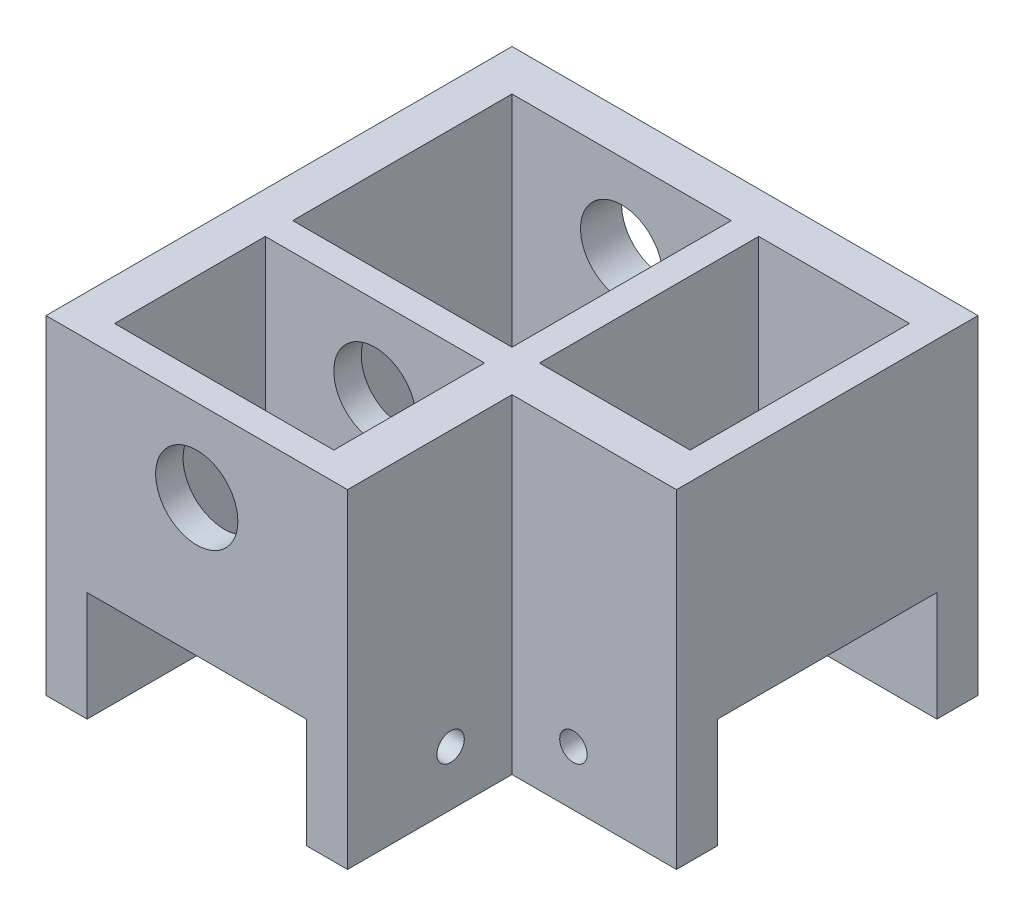
ISO-10303-21;
HEADER;
FILE_DESCRIPTION(('STEP AP214'),'2;1');
FILE_NAME('part.step','',(''),(''),'','','');
FILE_SCHEMA(('AUTOMOTIVE_DESIGN { 1 0 10303 214 1 1 1 1 }'));
ENDSEC;
DATA;
#1=APPLICATION_CONTEXT('core data for automotive mechanical design processes');
#2=APPLICATION_PROTOCOL_DEFINITION('international standard','automotive_design',2000,#1);
#3=PRODUCT_CONTEXT('',#1,'mechanical');
#4=PRODUCT('Part','Part','',(#3));
#5=PRODUCT_RELATED_PRODUCT_CATEGORY('part','',(#4));
#6=PRODUCT_DEFINITION_FORMATION('','',#4);
#7=PRODUCT_DEFINITION_CONTEXT('part definition',#1,'design');
#8=PRODUCT_DEFINITION('design','',#6,#7);
#9=PRODUCT_DEFINITION_SHAPE('','',#8);
#10=(LENGTH_UNIT() NAMED_UNIT(*) SI_UNIT(.MILLI.,.METRE.));
#11=(NAMED_UNIT(*) PLANE_ANGLE_UNIT() SI_UNIT($,.RADIAN.));
#12=(NAMED_UNIT(*) SI_UNIT($,.STERADIAN.) SOLID_ANGLE_UNIT());
#13=UNCERTAINTY_MEASURE_WITH_UNIT(LENGTH_MEASURE(1.E-05),#10,'distance_accuracy_value','');
#14=(GEOMETRIC_REPRESENTATION_CONTEXT(3) GLOBAL_UNCERTAINTY_ASSIGNED_CONTEXT((#13)) GLOBAL_UNIT_ASSIGNED_CONTEXT((#10,
#11,#12)) REPRESENTATION_CONTEXT('',''));
#15=CARTESIAN_POINT('',(0.,0.,0.));
#16=DIRECTION('',(0.,0.,1.));
#17=DIRECTION('',(1.,0.,0.));
#18=AXIS2_PLACEMENT_3D('',#15,#16,#17);
#19=CARTESIAN_POINT('',(144.78,152.4,0.));
#20=DIRECTION('',(0.,1.,0.));
#21=DIRECTION('',(0.,0.,1.));
#22=AXIS2_PLACEMENT_3D('',#19,#20,#21);
#23=PLANE('',#22);
#24=DIRECTION('',(0.,0.,1.));
#25=VECTOR('',#24,1.);
#26=CARTESIAN_POINT('',(278.13,152.4,-50.8));
#27=LINE('',#26,#25);
#28=CARTESIAN_POINT('',(278.13,152.4,-50.8));
#29=VERTEX_POINT('',#28);
#30=CARTESIAN_POINT('',(278.13,152.4,50.8));
#31=VERTEX_POINT('',#30);
#32=EDGE_CURVE('E299',#29,#31,#27,.T.);
#33=ORIENTED_EDGE('',*,*,#32,.T.);
#34=DIRECTION('',(-1.,0.,0.));
#35=VECTOR('',#34,1.);
#36=CARTESIAN_POINT('',(278.13,152.4,50.8));
#37=LINE('',#36,#35);
#38=CARTESIAN_POINT('',(208.28,152.4,50.8));
#39=VERTEX_POINT('',#38);
#40=EDGE_CURVE('E302',#31,#39,#37,.T.);
#41=ORIENTED_EDGE('',*,*,#40,.T.);
#42=DIRECTION('',(0.,0.,-1.));
#43=VECTOR('',#42,1.);
#44=CARTESIAN_POINT('',(208.28,152.4,-50.8));
#45=LINE('',#44,#43);
#46=CARTESIAN_POINT('',(208.28,152.4,-50.8));
#47=VERTEX_POINT('',#46);
#48=EDGE_CURVE('E305',#39,#47,#45,.T.);
#49=ORIENTED_EDGE('',*,*,#48,.T.);
#50=DIRECTION('',(1.,0.,0.));
#51=VECTOR('',#50,1.);
#52=CARTESIAN_POINT('',(278.13,152.4,-50.8));
#53=LINE('',#52,#51);
#54=EDGE_CURVE('E308',#47,#29,#53,.T.);
#55=ORIENTED_EDGE('',*,*,#54,.T.);
#56=EDGE_LOOP('',(#33,#41,#49,#55));
#57=FACE_BOUND('',#56,.T.);
#58=DIRECTION('',(0.,0.,-1.));
#59=VECTOR('',#58,1.);
#60=CARTESIAN_POINT('',(74.93,152.4,0.));
#61=LINE('',#60,#59);
#62=CARTESIAN_POINT('',(74.9299999999999,152.4,146.05));
#63=VERTEX_POINT('',#62);
#64=CARTESIAN_POINT('',(74.93,152.4,-69.85));
#65=VERTEX_POINT('',#64);
#66=EDGE_CURVE('E380',#63,#65,#61,.T.);
#67=ORIENTED_EDGE('',*,*,#66,.F.);
#68=DIRECTION('',(-1.,0.,0.));
#69=VECTOR('',#68,1.);
#70=CARTESIAN_POINT('',(214.63,152.4,146.05));
#71=LINE('',#70,#69);
#72=CARTESIAN_POINT('',(214.63,152.4,146.05));
#73=VERTEX_POINT('',#72);
#74=EDGE_CURVE('E254',#73,#63,#71,.T.);
#75=ORIENTED_EDGE('',*,*,#74,.F.);
#76=DIRECTION('',(0.,0.,-1.));
#77=VECTOR('',#76,1.);
#78=CARTESIAN_POINT('',(214.63,152.4,146.05));
#79=LINE('',#78,#77);
#80=CARTESIAN_POINT('',(214.63,152.4,69.85));
#81=VERTEX_POINT('',#80);
#82=EDGE_CURVE('E271',#73,#81,#79,.T.);
#83=ORIENTED_EDGE('',*,*,#82,.T.);
#84=DIRECTION('',(-1.,0.,0.));
#85=VECTOR('',#84,1.);
#86=CARTESIAN_POINT('',(144.78,152.4,69.85));
#87=LINE('',#86,#85);
#88=CARTESIAN_POINT('',(290.83,152.4,69.85));
#89=VERTEX_POINT('',#88);
#90=EDGE_CURVE('E387',#89,#81,#87,.T.);
#91=ORIENTED_EDGE('',*,*,#90,.F.);
#92=DIRECTION('',(0.,0.,-1.));
#93=VECTOR('',#92,1.);
#94=CARTESIAN_POINT('',(290.83,152.4,69.85));
#95=LINE('',#94,#93);
#96=CARTESIAN_POINT('',(290.83,152.4,-69.85));
#97=VERTEX_POINT('',#96);
#98=EDGE_CURVE('E330',#89,#97,#95,.T.);
#99=ORIENTED_EDGE('',*,*,#98,.T.);
#100=DIRECTION('',(1.,0.,0.));
#101=VECTOR('',#100,1.);
#102=CARTESIAN_POINT('',(144.78,152.4,-69.85));
#103=LINE('',#102,#101);
#104=EDGE_CURVE('E383',#65,#97,#103,.T.);
#105=ORIENTED_EDGE('',*,*,#104,.F.);
#106=EDGE_LOOP('',(#67,#75,#83,#91,#99,#105));
#107=FACE_BOUND('',#106,.T.);
#108=DIRECTION('',(1.,0.,0.));
#109=VECTOR('',#108,1.);
#110=CARTESIAN_POINT('',(195.58,152.4,-50.8));
#111=LINE('',#110,#109);
#112=CARTESIAN_POINT('',(93.98,152.4,-50.8));
#113=VERTEX_POINT('',#112);
#114=CARTESIAN_POINT('',(195.58,152.4,-50.8));
#115=VERTEX_POINT('',#114);
#116=EDGE_CURVE('E353',#113,#115,#111,.T.);
#117=ORIENTED_EDGE('',*,*,#116,.T.);
#118=DIRECTION('',(0.,0.,1.));
#119=VECTOR('',#118,1.);
#120=CARTESIAN_POINT('',(195.58,152.4,50.8));
#121=LINE('',#120,#119);
#122=CARTESIAN_POINT('',(195.58,152.4,50.8));
#123=VERTEX_POINT('',#122);
#124=EDGE_CURVE('E357',#115,#123,#121,.T.);
#125=ORIENTED_EDGE('',*,*,#124,.T.);
#126=DIRECTION('',(-1.,0.,0.));
#127=VECTOR('',#126,1.);
#128=CARTESIAN_POINT('',(195.58,152.4,50.8));
#129=LINE('',#128,#127);
#130=CARTESIAN_POINT('',(93.98,152.4,50.8));
#131=VERTEX_POINT('',#130);
#132=EDGE_CURVE('E360',#123,#131,#129,.T.);
#133=ORIENTED_EDGE('',*,*,#132,.T.);
#134=DIRECTION('',(0.,0.,-1.));
#135=VECTOR('',#134,1.);
#136=CARTESIAN_POINT('',(93.98,152.4,50.8));
#137=LINE('',#136,#135);
#138=EDGE_CURVE('E350',#131,#113,#137,.T.);
#139=ORIENTED_EDGE('',*,*,#138,.T.);
#140=EDGE_LOOP('',(#117,#125,#133,#139));
#141=FACE_BOUND('',#140,.T.);
#142=DIRECTION('',(0.,0.,1.));
#143=VECTOR('',#142,1.);
#144=CARTESIAN_POINT('',(93.9799999999999,152.4,133.35));
#145=LINE('',#144,#143);
#146=CARTESIAN_POINT('',(93.98,152.4,63.5));
#147=VERTEX_POINT('',#146);
#148=CARTESIAN_POINT('',(93.9799999999999,152.4,133.35));
#149=VERTEX_POINT('',#148);
#150=EDGE_CURVE('E221',#147,#149,#145,.T.);
#151=ORIENTED_EDGE('',*,*,#150,.F.);
#152=DIRECTION('',(-1.,0.,0.));
#153=VECTOR('',#152,1.);
#154=CARTESIAN_POINT('',(93.98,152.4,63.5));
#155=LINE('',#154,#153);
#156=CARTESIAN_POINT('',(195.58,152.4,63.5));
#157=VERTEX_POINT('',#156);
#158=EDGE_CURVE('E228',#157,#147,#155,.T.);
#159=ORIENTED_EDGE('',*,*,#158,.F.);
#160=DIRECTION('',(0.,0.,-1.));
#161=VECTOR('',#160,1.);
#162=CARTESIAN_POINT('',(195.58,152.4,133.35));
#163=LINE('',#162,#161);
#164=CARTESIAN_POINT('',(195.58,152.4,133.35));
#165=VERTEX_POINT('',#164);
#166=EDGE_CURVE('E233',#165,#157,#163,.T.);
#167=ORIENTED_EDGE('',*,*,#166,.F.);
#168=DIRECTION('',(1.,0.,0.));
#169=VECTOR('',#168,1.);
#170=CARTESIAN_POINT('',(93.9799999999999,152.4,133.35));
#171=LINE('',#170,#169);
#172=EDGE_CURVE('E235',#149,#165,#171,.T.);
#173=ORIENTED_EDGE('',*,*,#172,.F.);
#174=EDGE_LOOP('',(#151,#159,#167,#173));
#175=FACE_BOUND('',#174,.T.);
#176=ADVANCED_FACE('F65',(#57,#107,#141,#175),#23,.T.);
#177=CARTESIAN_POINT('',(144.78,50.8,0.));
#178=DIRECTION('',(0.,1.,0.));
#179=DIRECTION('',(0.,0.,1.));
#180=AXIS2_PLACEMENT_3D('',#177,#178,#179);
#181=PLANE('',#180);
#182=DIRECTION('',(1.,0.,0.));
#183=VECTOR('',#182,1.);
#184=CARTESIAN_POINT('',(144.78,50.8,133.35));
#185=LINE('',#184,#183);
#186=CARTESIAN_POINT('',(93.9799999999999,50.8,133.35));
#187=VERTEX_POINT('',#186);
#188=CARTESIAN_POINT('',(195.58,50.8,133.35));
#189=VERTEX_POINT('',#188);
#190=EDGE_CURVE('E12',#187,#189,#185,.T.);
#191=ORIENTED_EDGE('',*,*,#190,.T.);
#192=DIRECTION('',(0.,0.,1.));
#193=VECTOR('',#192,1.);
#194=CARTESIAN_POINT('',(195.58,50.8,50.8));
#195=LINE('',#194,#193);
#196=CARTESIAN_POINT('',(195.58,50.8,146.05));
#197=VERTEX_POINT('',#196);
#198=EDGE_CURVE('E282',#189,#197,#195,.T.);
#199=ORIENTED_EDGE('',*,*,#198,.T.);
#200=DIRECTION('',(1.,0.,0.));
#201=VECTOR('',#200,1.);
#202=CARTESIAN_POINT('',(93.9799999999999,50.8,146.05));
#203=LINE('',#202,#201);
#204=CARTESIAN_POINT('',(93.9799999999999,50.8,146.05));
#205=VERTEX_POINT('',#204);
#206=EDGE_CURVE('E264',#205,#197,#203,.T.);
#207=ORIENTED_EDGE('',*,*,#206,.F.);
#208=DIRECTION('',(0.,0.,-1.));
#209=VECTOR('',#208,1.);
#210=CARTESIAN_POINT('',(93.98,50.8,50.8));
#211=LINE('',#210,#209);
#212=EDGE_CURVE('E286',#205,#187,#211,.T.);
#213=ORIENTED_EDGE('',*,*,#212,.T.);
#214=EDGE_LOOP('',(#191,#199,#207,#213));
#215=FACE_BOUND('',#214,.T.);
#216=ADVANCED_FACE('F431',(#215),#181,.F.);
#217=DIRECTION('',(-1.,0.,0.));
#218=VECTOR('',#217,1.);
#219=CARTESIAN_POINT('',(144.78,50.8,63.5));
#220=LINE('',#219,#218);
#221=CARTESIAN_POINT('',(195.58,50.8,63.5));
#222=VERTEX_POINT('',#221);
#223=CARTESIAN_POINT('',(93.98,50.8,63.5));
#224=VERTEX_POINT('',#223);
#225=EDGE_CURVE('E74',#222,#224,#220,.T.);
#226=ORIENTED_EDGE('',*,*,#225,.T.);
#227=CARTESIAN_POINT('',(93.98,50.8,50.8));
#228=VERTEX_POINT('',#227);
#229=EDGE_CURVE('E223',#224,#228,#211,.T.);
#230=ORIENTED_EDGE('',*,*,#229,.T.);
#231=DIRECTION('',(1.,0.,0.));
#232=VECTOR('',#231,1.);
#233=CARTESIAN_POINT('',(195.58,50.8,50.8));
#234=LINE('',#233,#232);
#235=CARTESIAN_POINT('',(195.58,50.8,50.8));
#236=VERTEX_POINT('',#235);
#237=EDGE_CURVE('E283',#228,#236,#234,.T.);
#238=ORIENTED_EDGE('',*,*,#237,.T.);
#239=EDGE_CURVE('E278',#236,#222,#195,.T.);
#240=ORIENTED_EDGE('',*,*,#239,.T.);
#241=EDGE_LOOP('',(#226,#230,#238,#240));
#242=FACE_BOUND('',#241,.T.);
#243=ADVANCED_FACE('F406',(#242),#181,.F.);
#244=CARTESIAN_POINT('',(144.78,0.,0.));
#245=DIRECTION('',(0.,1.,0.));
#246=DIRECTION('',(0.,0.,1.));
#247=AXIS2_PLACEMENT_3D('',#244,#245,#246);
#248=PLANE('',#247);
#249=DIRECTION('',(0.,0.,1.));
#250=VECTOR('',#249,1.);
#251=CARTESIAN_POINT('',(195.58,0.,50.8));
#252=LINE('',#251,#250);
#253=CARTESIAN_POINT('',(195.58,0.,50.8));
#254=VERTEX_POINT('',#253);
#255=CARTESIAN_POINT('',(195.58,0.,146.05));
#256=VERTEX_POINT('',#255);
#257=EDGE_CURVE('E275',#254,#256,#252,.T.);
#258=ORIENTED_EDGE('',*,*,#257,.F.);
#259=DIRECTION('',(-1.,0.,0.));
#260=VECTOR('',#259,1.);
#261=CARTESIAN_POINT('',(195.58,0.,50.8));
#262=LINE('',#261,#260);
#263=CARTESIAN_POINT('',(290.83,0.,50.8));
#264=VERTEX_POINT('',#263);
#265=EDGE_CURVE('E354',#264,#254,#262,.T.);
#266=ORIENTED_EDGE('',*,*,#265,.F.);
#267=DIRECTION('',(0.,0.,1.));
#268=VECTOR('',#267,1.);
#269=CARTESIAN_POINT('',(290.83,0.,50.8));
#270=LINE('',#269,#268);
#271=CARTESIAN_POINT('',(290.83,0.,69.85));
#272=VERTEX_POINT('',#271);
#273=EDGE_CURVE('E325',#264,#272,#270,.T.);
#274=ORIENTED_EDGE('',*,*,#273,.T.);
#275=DIRECTION('',(-1.,0.,0.));
#276=VECTOR('',#275,1.);
#277=CARTESIAN_POINT('',(144.78,0.,69.85));
#278=LINE('',#277,#276);
#279=CARTESIAN_POINT('',(214.63,0.,69.85));
#280=VERTEX_POINT('',#279);
#281=EDGE_CURVE('E384',#272,#280,#278,.T.);
#282=ORIENTED_EDGE('',*,*,#281,.T.);
#283=DIRECTION('',(0.,0.,-1.));
#284=VECTOR('',#283,1.);
#285=CARTESIAN_POINT('',(214.63,0.,146.05));
#286=LINE('',#285,#284);
#287=CARTESIAN_POINT('',(214.63,0.,146.05));
#288=VERTEX_POINT('',#287);
#289=EDGE_CURVE('E267',#288,#280,#286,.T.);
#290=ORIENTED_EDGE('',*,*,#289,.F.);
#291=DIRECTION('',(1.,0.,0.));
#292=VECTOR('',#291,1.);
#293=CARTESIAN_POINT('',(195.58,0.,146.05));
#294=LINE('',#293,#292);
#295=EDGE_CURVE('E259',#256,#288,#294,.T.);
#296=ORIENTED_EDGE('',*,*,#295,.F.);
#297=EDGE_LOOP('',(#258,#266,#274,#282,#290,#296));
#298=FACE_BOUND('',#297,.T.);
#299=ADVANCED_FACE('F443',(#298),#248,.F.);
#300=DIRECTION('',(0.,0.,-1.));
#301=VECTOR('',#300,1.);
#302=CARTESIAN_POINT('',(74.93,0.,0.));
#303=LINE('',#302,#301);
#304=CARTESIAN_POINT('',(74.9299999999999,0.,146.05));
#305=VERTEX_POINT('',#304);
#306=CARTESIAN_POINT('',(74.93,0.,-69.85));
#307=VERTEX_POINT('',#306);
#308=EDGE_CURVE('E379',#305,#307,#303,.T.);
#309=ORIENTED_EDGE('',*,*,#308,.T.);
#310=DIRECTION('',(1.,0.,0.));
#311=VECTOR('',#310,1.);
#312=CARTESIAN_POINT('',(144.78,0.,-69.85));
#313=LINE('',#312,#311);
#314=CARTESIAN_POINT('',(290.83,0.,-69.85));
#315=VERTEX_POINT('',#314);
#316=EDGE_CURVE('E393',#307,#315,#313,.T.);
#317=ORIENTED_EDGE('',*,*,#316,.T.);
#318=DIRECTION('',(0.,0.,1.));
#319=VECTOR('',#318,1.);
#320=CARTESIAN_POINT('',(290.83,0.,-69.85));
#321=LINE('',#320,#319);
#322=CARTESIAN_POINT('',(290.83,0.,-50.8));
#323=VERTEX_POINT('',#322);
#324=EDGE_CURVE('E335',#315,#323,#321,.T.);
#325=ORIENTED_EDGE('',*,*,#324,.T.);
#326=DIRECTION('',(1.,0.,0.));
#327=VECTOR('',#326,1.);
#328=CARTESIAN_POINT('',(195.58,0.,-50.8));
#329=LINE('',#328,#327);
#330=CARTESIAN_POINT('',(93.98,0.,-50.8));
#331=VERTEX_POINT('',#330);
#332=EDGE_CURVE('E366',#331,#323,#329,.T.);
#333=ORIENTED_EDGE('',*,*,#332,.F.);
#334=DIRECTION('',(0.,0.,-1.));
#335=VECTOR('',#334,1.);
#336=CARTESIAN_POINT('',(93.98,0.,50.8));
#337=LINE('',#336,#335);
#338=CARTESIAN_POINT('',(93.9799999999999,0.,146.05));
#339=VERTEX_POINT('',#338);
#340=EDGE_CURVE('E346',#339,#331,#337,.T.);
#341=ORIENTED_EDGE('',*,*,#340,.F.);
#342=DIRECTION('',(1.,0.,0.));
#343=VECTOR('',#342,1.);
#344=CARTESIAN_POINT('',(74.9299999999999,0.,146.05));
#345=LINE('',#344,#343);
#346=EDGE_CURVE('E249',#305,#339,#345,.T.);
#347=ORIENTED_EDGE('',*,*,#346,.F.);
#348=EDGE_LOOP('',(#309,#317,#325,#333,#341,#347));
#349=FACE_BOUND('',#348,.T.);
#350=ADVANCED_FACE('F446',(#349),#248,.F.);
#351=CARTESIAN_POINT('',(144.78,152.4,69.85));
#352=DIRECTION('',(0.,0.,-1.));
#353=DIRECTION('',(1.,0.,0.));
#354=AXIS2_PLACEMENT_3D('',#351,#352,#353);
#355=PLANE('',#354);
#356=CARTESIAN_POINT('',(243.078,25.4,69.85));
#357=DIRECTION('',(0.,0.,-1.));
#358=DIRECTION('',(-1.,0.,0.));
#359=AXIS2_PLACEMENT_3D('',#356,#357,#358);
#360=CIRCLE('',#359,6.35);
#361=CARTESIAN_POINT('',(236.728,25.4,69.85));
#362=VERTEX_POINT('',#361);
#363=EDGE_CURVE('E281',#362,#362,#360,.T.);
#364=ORIENTED_EDGE('',*,*,#363,.T.);
#365=EDGE_LOOP('',(#364));
#366=FACE_BOUND('',#365,.T.);
#367=ORIENTED_EDGE('',*,*,#281,.F.);
#368=DIRECTION('',(0.,1.,0.));
#369=VECTOR('',#368,1.);
#370=CARTESIAN_POINT('',(290.83,0.,69.85));
#371=LINE('',#370,#369);
#372=EDGE_CURVE('E328',#272,#89,#371,.T.);
#373=ORIENTED_EDGE('',*,*,#372,.T.);
#374=ORIENTED_EDGE('',*,*,#90,.T.);
#375=DIRECTION('',(0.,1.,0.));
#376=VECTOR('',#375,1.);
#377=CARTESIAN_POINT('',(214.63,0.,69.85));
#378=LINE('',#377,#376);
#379=EDGE_CURVE('E244',#280,#81,#378,.T.);
#380=ORIENTED_EDGE('',*,*,#379,.F.);
#381=EDGE_LOOP('',(#367,#373,#374,#380));
#382=FACE_BOUND('',#381,.T.);
#383=ADVANCED_FACE('F448',(#366,#382),#355,.F.);
#384=CARTESIAN_POINT('',(195.58,152.4,50.8));
#385=DIRECTION('',(0.,0.,-1.));
#386=DIRECTION('',(1.,0.,0.));
#387=AXIS2_PLACEMENT_3D('',#384,#385,#386);
#388=PLANE('',#387);
#389=CARTESIAN_POINT('',(243.078,25.4,50.8));
#390=DIRECTION('',(0.,0.,1.));
#391=DIRECTION('',(1.,0.,0.));
#392=AXIS2_PLACEMENT_3D('',#389,#390,#391);
#393=CIRCLE('',#392,6.35);
#394=CARTESIAN_POINT('',(249.428,25.4,50.8));
#395=VERTEX_POINT('',#394);
#396=EDGE_CURVE('E293',#395,#395,#393,.T.);
#397=ORIENTED_EDGE('',*,*,#396,.T.);
#398=EDGE_LOOP('',(#397));
#399=FACE_BOUND('',#398,.T.);
#400=DIRECTION('',(1.,0.,0.));
#401=VECTOR('',#400,1.);
#402=CARTESIAN_POINT('',(195.58,50.8,50.8));
#403=LINE('',#402,#401);
#404=CARTESIAN_POINT('',(208.28,50.8,50.8));
#405=VERTEX_POINT('',#404);
#406=EDGE_CURVE('E339',#236,#405,#403,.T.);
#407=ORIENTED_EDGE('',*,*,#406,.T.);
#408=DIRECTION('',(0.,1.,0.));
#409=VECTOR('',#408,1.);
#410=CARTESIAN_POINT('',(208.28,0.,50.8));
#411=LINE('',#410,#409);
#412=EDGE_CURVE('E317',#405,#39,#411,.T.);
#413=ORIENTED_EDGE('',*,*,#412,.T.);
#414=ORIENTED_EDGE('',*,*,#40,.F.);
#415=DIRECTION('',(0.,1.,0.));
#416=VECTOR('',#415,1.);
#417=CARTESIAN_POINT('',(278.13,0.,50.8));
#418=LINE('',#417,#416);
#419=CARTESIAN_POINT('',(278.13,50.8,50.8));
#420=VERTEX_POINT('',#419);
#421=EDGE_CURVE('E311',#420,#31,#418,.T.);
#422=ORIENTED_EDGE('',*,*,#421,.F.);
#423=CARTESIAN_POINT('',(290.83,50.8,50.8));
#424=VERTEX_POINT('',#423);
#425=EDGE_CURVE('E338',#420,#424,#403,.T.);
#426=ORIENTED_EDGE('',*,*,#425,.T.);
#427=DIRECTION('',(0.,-1.,0.));
#428=VECTOR('',#427,1.);
#429=CARTESIAN_POINT('',(290.83,50.8,50.8));
#430=LINE('',#429,#428);
#431=EDGE_CURVE('E323',#424,#264,#430,.T.);
#432=ORIENTED_EDGE('',*,*,#431,.T.);
#433=ORIENTED_EDGE('',*,*,#265,.T.);
#434=DIRECTION('',(0.,-1.,0.));
#435=VECTOR('',#434,1.);
#436=CARTESIAN_POINT('',(195.58,154.170510785233,50.8));
#437=LINE('',#436,#435);
#438=EDGE_CURVE('E274',#236,#254,#437,.T.);
#439=ORIENTED_EDGE('',*,*,#438,.F.);
#440=EDGE_LOOP('',(#407,#413,#414,#422,#426,#432,#433,#439));
#441=FACE_BOUND('',#440,.T.);
#442=ADVANCED_FACE('F450',(#399,#441),#388,.T.);
#443=CARTESIAN_POINT('',(144.78,50.8,0.));
#444=DIRECTION('',(0.,1.,0.));
#445=DIRECTION('',(0.,0.,1.));
#446=AXIS2_PLACEMENT_3D('',#443,#444,#445);
#447=PLANE('',#446);
#448=DIRECTION('',(-1.,0.,0.));
#449=VECTOR('',#448,1.);
#450=CARTESIAN_POINT('',(195.58,50.8,-50.8));
#451=LINE('',#450,#449);
#452=CARTESIAN_POINT('',(290.83,50.8,-50.8));
#453=VERTEX_POINT('',#452);
#454=CARTESIAN_POINT('',(278.13,50.8,-50.8));
#455=VERTEX_POINT('',#454);
#456=EDGE_CURVE('E347',#453,#455,#451,.T.);
#457=ORIENTED_EDGE('',*,*,#456,.F.);
#458=DIRECTION('',(0.,0.,1.));
#459=VECTOR('',#458,1.);
#460=CARTESIAN_POINT('',(290.83,50.8,-50.8));
#461=LINE('',#460,#459);
#462=EDGE_CURVE('E321',#453,#424,#461,.T.);
#463=ORIENTED_EDGE('',*,*,#462,.T.);
#464=ORIENTED_EDGE('',*,*,#425,.F.);
#465=DIRECTION('',(0.,0.,1.));
#466=VECTOR('',#465,1.);
#467=CARTESIAN_POINT('',(278.13,50.8,0.));
#468=LINE('',#467,#466);
#469=EDGE_CURVE('E401',#455,#420,#468,.T.);
#470=ORIENTED_EDGE('',*,*,#469,.F.);
#471=EDGE_LOOP('',(#457,#463,#464,#470));
#472=FACE_BOUND('',#471,.T.);
#473=ADVANCED_FACE('F463',(#472),#447,.F.);
#474=CARTESIAN_POINT('',(74.93,152.4,0.));
#475=DIRECTION('',(1.,0.,0.));
#476=DIRECTION('',(0.,0.,1.));
#477=AXIS2_PLACEMENT_3D('',#474,#475,#476);
#478=PLANE('',#477);
#479=CARTESIAN_POINT('',(74.9299999999999,25.4,98.298));
#480=DIRECTION('',(1.,0.,0.));
#481=DIRECTION('',(0.,0.,-1.));
#482=AXIS2_PLACEMENT_3D('',#479,#480,#481);
#483=CIRCLE('',#482,6.35);
#484=CARTESIAN_POINT('',(74.9299999999999,25.4,91.948));
#485=VERTEX_POINT('',#484);
#486=EDGE_CURVE('E907',#485,#485,#483,.T.);
#487=ORIENTED_EDGE('',*,*,#486,.T.);
#488=EDGE_LOOP('',(#487));
#489=FACE_BOUND('',#488,.T.);
#490=ORIENTED_EDGE('',*,*,#308,.F.);
#491=DIRECTION('',(0.,-1.,0.));
#492=VECTOR('',#491,1.);
#493=CARTESIAN_POINT('',(74.9299999999999,152.4,146.05));
#494=LINE('',#493,#492);
#495=EDGE_CURVE('E252',#63,#305,#494,.T.);
#496=ORIENTED_EDGE('',*,*,#495,.F.);
#497=ORIENTED_EDGE('',*,*,#66,.T.);
#498=DIRECTION('',(0.,-1.,0.));
#499=VECTOR('',#498,1.);
#500=CARTESIAN_POINT('',(74.93,152.4,-69.85));
#501=LINE('',#500,#499);
#502=EDGE_CURVE('E390',#65,#307,#501,.T.);
#503=ORIENTED_EDGE('',*,*,#502,.T.);
#504=EDGE_LOOP('',(#490,#496,#497,#503));
#505=FACE_BOUND('',#504,.T.);
#506=ADVANCED_FACE('F67',(#489,#505),#478,.F.);
#507=CARTESIAN_POINT('',(144.78,152.4,-69.85));
#508=DIRECTION('',(0.,0.,1.));
#509=DIRECTION('',(-1.,0.,0.));
#510=AXIS2_PLACEMENT_3D('',#507,#508,#509);
#511=PLANE('',#510);
#512=CARTESIAN_POINT('',(144.78,114.3,-69.85));
#513=DIRECTION('',(0.,0.,1.));
#514=DIRECTION('',(1.,0.,0.));
#515=AXIS2_PLACEMENT_3D('',#512,#513,#514);
#516=CIRCLE('',#515,19.05);
#517=CARTESIAN_POINT('',(163.83,114.3,-69.85));
#518=VERTEX_POINT('',#517);
#519=EDGE_CURVE('E468',#518,#518,#516,.T.);
#520=ORIENTED_EDGE('',*,*,#519,.T.);
#521=EDGE_LOOP('',(#520));
#522=FACE_BOUND('',#521,.T.);
#523=CARTESIAN_POINT('',(243.078,25.4,-69.85));
#524=DIRECTION('',(0.,0.,-1.));
#525=DIRECTION('',(-1.,0.,0.));
#526=AXIS2_PLACEMENT_3D('',#523,#524,#525);
#527=CIRCLE('',#526,6.35);
#528=CARTESIAN_POINT('',(236.728,25.4,-69.85));
#529=VERTEX_POINT('',#528);
#530=EDGE_CURVE('E290',#529,#529,#527,.T.);
#531=ORIENTED_EDGE('',*,*,#530,.F.);
#532=EDGE_LOOP('',(#531));
#533=FACE_BOUND('',#532,.T.);
#534=ORIENTED_EDGE('',*,*,#316,.F.);
#535=ORIENTED_EDGE('',*,*,#502,.F.);
#536=ORIENTED_EDGE('',*,*,#104,.T.);
#537=DIRECTION('',(0.,-1.,0.));
#538=VECTOR('',#537,1.);
#539=CARTESIAN_POINT('',(290.83,152.4,-69.85));
#540=LINE('',#539,#538);
#541=EDGE_CURVE('E333',#97,#315,#540,.T.);
#542=ORIENTED_EDGE('',*,*,#541,.T.);
#543=EDGE_LOOP('',(#534,#535,#536,#542));
#544=FACE_BOUND('',#543,.T.);
#545=ADVANCED_FACE('F452',(#522,#533,#544),#511,.F.);
#546=CARTESIAN_POINT('',(93.98,152.4,50.8));
#547=DIRECTION('',(1.,0.,0.));
#548=DIRECTION('',(0.,0.,1.));
#549=AXIS2_PLACEMENT_3D('',#546,#547,#548);
#550=PLANE('',#549);
#551=CARTESIAN_POINT('',(93.98,25.4,98.298));
#552=DIRECTION('',(-1.,0.,0.));
#553=DIRECTION('',(0.,0.,1.));
#554=AXIS2_PLACEMENT_3D('',#551,#552,#553);
#555=CIRCLE('',#554,6.35);
#556=CARTESIAN_POINT('',(93.98,25.4,104.648));
#557=VERTEX_POINT('',#556);
#558=EDGE_CURVE('E237',#557,#557,#555,.F.);
#559=ORIENTED_EDGE('',*,*,#558,.F.);
#560=EDGE_LOOP('',(#559));
#561=FACE_BOUND('',#560,.T.);
#562=DIRECTION('',(0.,-1.,0.));
#563=VECTOR('',#562,1.);
#564=CARTESIAN_POINT('',(93.98,152.4,-50.8));
#565=LINE('',#564,#563);
#566=EDGE_CURVE('E377',#113,#331,#565,.T.);
#567=ORIENTED_EDGE('',*,*,#566,.F.);
#568=ORIENTED_EDGE('',*,*,#138,.F.);
#569=DIRECTION('',(0.,-1.,0.));
#570=VECTOR('',#569,1.);
#571=CARTESIAN_POINT('',(93.98,152.4,50.8));
#572=LINE('',#571,#570);
#573=EDGE_CURVE('E363',#131,#228,#572,.T.);
#574=ORIENTED_EDGE('',*,*,#573,.T.);
#575=ORIENTED_EDGE('',*,*,#229,.F.);
#576=DIRECTION('',(0.,1.,0.));
#577=VECTOR('',#576,1.);
#578=CARTESIAN_POINT('',(93.98,0.,63.5));
#579=LINE('',#578,#577);
#580=EDGE_CURVE('E89',#224,#147,#579,.T.);
#581=ORIENTED_EDGE('',*,*,#580,.T.);
#582=ORIENTED_EDGE('',*,*,#150,.T.);
#583=DIRECTION('',(0.,1.,0.));
#584=VECTOR('',#583,1.);
#585=CARTESIAN_POINT('',(93.9799999999999,0.,133.35));
#586=LINE('',#585,#584);
#587=EDGE_CURVE('E81',#187,#149,#586,.T.);
#588=ORIENTED_EDGE('',*,*,#587,.F.);
#589=ORIENTED_EDGE('',*,*,#212,.F.);
#590=DIRECTION('',(0.,1.,0.));
#591=VECTOR('',#590,1.);
#592=CARTESIAN_POINT('',(93.9799999999999,0.,146.05));
#593=LINE('',#592,#591);
#594=EDGE_CURVE('E247',#339,#205,#593,.T.);
#595=ORIENTED_EDGE('',*,*,#594,.F.);
#596=ORIENTED_EDGE('',*,*,#340,.T.);
#597=EDGE_LOOP('',(#567,#568,#574,#575,#581,#582,#588,#589,#595,#596));
#598=FACE_BOUND('',#597,.T.);
#599=ADVANCED_FACE('F219',(#561,#598),#550,.T.);
#600=CARTESIAN_POINT('',(195.58,152.4,-50.8));
#601=DIRECTION('',(0.,0.,1.));
#602=DIRECTION('',(-1.,0.,0.));
#603=AXIS2_PLACEMENT_3D('',#600,#601,#602);
#604=PLANE('',#603);
#605=CARTESIAN_POINT('',(144.78,114.3,-50.8));
#606=DIRECTION('',(0.,0.,1.));
#607=DIRECTION('',(1.,0.,0.));
#608=AXIS2_PLACEMENT_3D('',#605,#606,#607);
#609=CIRCLE('',#608,19.05);
#610=CARTESIAN_POINT('',(163.83,114.3,-50.8));
#611=VERTEX_POINT('',#610);
#612=EDGE_CURVE('E900',#611,#611,#609,.T.);
#613=ORIENTED_EDGE('',*,*,#612,.F.);
#614=EDGE_LOOP('',(#613));
#615=FACE_BOUND('',#614,.T.);
#616=CARTESIAN_POINT('',(243.078,25.4,-50.8));
#617=DIRECTION('',(0.,0.,-1.));
#618=DIRECTION('',(-1.,0.,0.));
#619=AXIS2_PLACEMENT_3D('',#616,#617,#618);
#620=CIRCLE('',#619,6.35);
#621=CARTESIAN_POINT('',(236.728,25.4,-50.8));
#622=VERTEX_POINT('',#621);
#623=EDGE_CURVE('E296',#622,#622,#620,.T.);
#624=ORIENTED_EDGE('',*,*,#623,.T.);
#625=EDGE_LOOP('',(#624));
#626=FACE_BOUND('',#625,.T.);
#627=CARTESIAN_POINT('',(208.28,50.8,-50.8));
#628=VERTEX_POINT('',#627);
#629=CARTESIAN_POINT('',(195.58,50.8,-50.8));
#630=VERTEX_POINT('',#629);
#631=EDGE_CURVE('E342',#628,#630,#451,.T.);
#632=ORIENTED_EDGE('',*,*,#631,.T.);
#633=DIRECTION('',(0.,-1.,0.));
#634=VECTOR('',#633,1.);
#635=CARTESIAN_POINT('',(195.58,152.4,-50.8));
#636=LINE('',#635,#634);
#637=EDGE_CURVE('E374',#115,#630,#636,.T.);
#638=ORIENTED_EDGE('',*,*,#637,.F.);
#639=ORIENTED_EDGE('',*,*,#116,.F.);
#640=ORIENTED_EDGE('',*,*,#566,.T.);
#641=ORIENTED_EDGE('',*,*,#332,.T.);
#642=DIRECTION('',(0.,1.,0.));
#643=VECTOR('',#642,1.);
#644=CARTESIAN_POINT('',(290.83,0.,-50.8));
#645=LINE('',#644,#643);
#646=EDGE_CURVE('E314',#323,#453,#645,.T.);
#647=ORIENTED_EDGE('',*,*,#646,.T.);
#648=ORIENTED_EDGE('',*,*,#456,.T.);
#649=DIRECTION('',(0.,1.,0.));
#650=VECTOR('',#649,1.);
#651=CARTESIAN_POINT('',(278.13,0.,-50.8));
#652=LINE('',#651,#650);
#653=EDGE_CURVE('E312',#455,#29,#652,.T.);
#654=ORIENTED_EDGE('',*,*,#653,.T.);
#655=ORIENTED_EDGE('',*,*,#54,.F.);
#656=DIRECTION('',(0.,1.,0.));
#657=VECTOR('',#656,1.);
#658=CARTESIAN_POINT('',(208.28,0.,-50.8));
#659=LINE('',#658,#657);
#660=EDGE_CURVE('E315',#628,#47,#659,.T.);
#661=ORIENTED_EDGE('',*,*,#660,.F.);
#662=EDGE_LOOP('',(#632,#638,#639,#640,#641,#647,#648,#654,#655,#661));
#663=FACE_BOUND('',#662,.T.);
#664=ADVANCED_FACE('F460',(#615,#626,#663),#604,.T.);
#665=CARTESIAN_POINT('',(195.58,152.4,50.8));
#666=DIRECTION('',(-1.,0.,0.));
#667=DIRECTION('',(0.,0.,-1.));
#668=AXIS2_PLACEMENT_3D('',#665,#666,#667);
#669=PLANE('',#668);
#670=DIRECTION('',(0.,0.,1.));
#671=VECTOR('',#670,1.);
#672=CARTESIAN_POINT('',(195.58,50.8,50.8));
#673=LINE('',#672,#671);
#674=EDGE_CURVE('E343',#630,#236,#673,.T.);
#675=ORIENTED_EDGE('',*,*,#674,.T.);
#676=DIRECTION('',(0.,-1.,0.));
#677=VECTOR('',#676,1.);
#678=CARTESIAN_POINT('',(195.58,152.4,50.8));
#679=LINE('',#678,#677);
#680=EDGE_CURVE('E372',#123,#236,#679,.T.);
#681=ORIENTED_EDGE('',*,*,#680,.F.);
#682=ORIENTED_EDGE('',*,*,#124,.F.);
#683=ORIENTED_EDGE('',*,*,#637,.T.);
#684=EDGE_LOOP('',(#675,#681,#682,#683));
#685=FACE_BOUND('',#684,.T.);
#686=ADVANCED_FACE('F528',(#685),#669,.T.);
#687=CARTESIAN_POINT('',(144.78,114.3,50.8));
#688=DIRECTION('',(0.,0.,-1.));
#689=DIRECTION('',(-1.,0.,0.));
#690=AXIS2_PLACEMENT_3D('',#687,#688,#689);
#691=CIRCLE('',#690,19.05);
#692=CARTESIAN_POINT('',(163.83,114.3,50.8));
#693=VERTEX_POINT('',#692);
#694=EDGE_CURVE('E904',#693,#693,#691,.T.);
#695=ORIENTED_EDGE('',*,*,#694,.F.);
#696=EDGE_LOOP('',(#695));
#697=FACE_BOUND('',#696,.T.);
#698=ORIENTED_EDGE('',*,*,#237,.F.);
#699=ORIENTED_EDGE('',*,*,#573,.F.);
#700=ORIENTED_EDGE('',*,*,#132,.F.);
#701=ORIENTED_EDGE('',*,*,#680,.T.);
#702=EDGE_LOOP('',(#698,#699,#700,#701));
#703=FACE_BOUND('',#702,.T.);
#704=ADVANCED_FACE('F531',(#697,#703),#388,.T.);
#705=ORIENTED_EDGE('',*,*,#406,.F.);
#706=ORIENTED_EDGE('',*,*,#674,.F.);
#707=ORIENTED_EDGE('',*,*,#631,.F.);
#708=DIRECTION('',(0.,0.,-1.));
#709=VECTOR('',#708,1.);
#710=CARTESIAN_POINT('',(208.28,50.8,0.));
#711=LINE('',#710,#709);
#712=EDGE_CURVE('E399',#405,#628,#711,.T.);
#713=ORIENTED_EDGE('',*,*,#712,.F.);
#714=EDGE_LOOP('',(#705,#706,#707,#713));
#715=FACE_BOUND('',#714,.T.);
#716=ADVANCED_FACE('F525',(#715),#447,.F.);
#717=CARTESIAN_POINT('',(290.83,0.,0.));
#718=DIRECTION('',(-1.,0.,0.));
#719=DIRECTION('',(0.,0.,-1.));
#720=AXIS2_PLACEMENT_3D('',#717,#718,#719);
#721=PLANE('',#720);
#722=ORIENTED_EDGE('',*,*,#646,.F.);
#723=ORIENTED_EDGE('',*,*,#324,.F.);
#724=ORIENTED_EDGE('',*,*,#541,.F.);
#725=ORIENTED_EDGE('',*,*,#98,.F.);
#726=ORIENTED_EDGE('',*,*,#372,.F.);
#727=ORIENTED_EDGE('',*,*,#273,.F.);
#728=ORIENTED_EDGE('',*,*,#431,.F.);
#729=ORIENTED_EDGE('',*,*,#462,.F.);
#730=EDGE_LOOP('',(#722,#723,#724,#725,#726,#727,#728,#729));
#731=FACE_BOUND('',#730,.T.);
#732=ADVANCED_FACE('F485',(#731),#721,.F.);
#733=CARTESIAN_POINT('',(278.13,0.,-50.8));
#734=DIRECTION('',(1.,0.,0.));
#735=DIRECTION('',(0.,0.,1.));
#736=AXIS2_PLACEMENT_3D('',#733,#734,#735);
#737=PLANE('',#736);
#738=ORIENTED_EDGE('',*,*,#653,.F.);
#739=ORIENTED_EDGE('',*,*,#469,.T.);
#740=ORIENTED_EDGE('',*,*,#421,.T.);
#741=ORIENTED_EDGE('',*,*,#32,.F.);
#742=EDGE_LOOP('',(#738,#739,#740,#741));
#743=FACE_BOUND('',#742,.T.);
#744=ADVANCED_FACE('F518',(#743),#737,.F.);
#745=CARTESIAN_POINT('',(208.28,0.,-50.8));
#746=DIRECTION('',(-1.,0.,0.));
#747=DIRECTION('',(0.,0.,-1.));
#748=AXIS2_PLACEMENT_3D('',#745,#746,#747);
#749=PLANE('',#748);
#750=ORIENTED_EDGE('',*,*,#412,.F.);
#751=ORIENTED_EDGE('',*,*,#712,.T.);
#752=ORIENTED_EDGE('',*,*,#660,.T.);
#753=ORIENTED_EDGE('',*,*,#48,.F.);
#754=EDGE_LOOP('',(#750,#751,#752,#753));
#755=FACE_BOUND('',#754,.T.);
#756=ADVANCED_FACE('F522',(#755),#749,.F.);
#757=CARTESIAN_POINT('',(243.078,25.4,-69.85));
#758=DIRECTION('',(0.,0.,1.));
#759=DIRECTION('',(-1.,0.,0.));
#760=AXIS2_PLACEMENT_3D('',#757,#758,#759);
#761=CYLINDRICAL_SURFACE('',#760,6.35);
#762=ORIENTED_EDGE('',*,*,#396,.F.);
#763=EDGE_LOOP('',(#762));
#764=FACE_BOUND('',#763,.T.);
#765=ORIENTED_EDGE('',*,*,#363,.F.);
#766=EDGE_LOOP('',(#765));
#767=FACE_BOUND('',#766,.T.);
#768=ADVANCED_FACE('F549',(#764,#767),#761,.F.);
#769=ORIENTED_EDGE('',*,*,#623,.F.);
#770=EDGE_LOOP('',(#769));
#771=FACE_BOUND('',#770,.T.);
#772=ORIENTED_EDGE('',*,*,#530,.T.);
#773=EDGE_LOOP('',(#772));
#774=FACE_BOUND('',#773,.T.);
#775=ADVANCED_FACE('F552',(#771,#774),#761,.F.);
#776=CARTESIAN_POINT('',(195.58,154.170510785233,50.8));
#777=DIRECTION('',(-1.,0.,0.));
#778=DIRECTION('',(0.,0.,-1.));
#779=AXIS2_PLACEMENT_3D('',#776,#777,#778);
#780=PLANE('',#779);
#781=CARTESIAN_POINT('',(195.58,25.4,98.298));
#782=DIRECTION('',(1.,0.,0.));
#783=DIRECTION('',(0.,0.,-1.));
#784=AXIS2_PLACEMENT_3D('',#781,#782,#783);
#785=CIRCLE('',#784,6.35);
#786=CARTESIAN_POINT('',(195.58,25.4,91.9480000000001));
#787=VERTEX_POINT('',#786);
#788=EDGE_CURVE('E915',#787,#787,#785,.F.);
#789=ORIENTED_EDGE('',*,*,#788,.F.);
#790=EDGE_LOOP('',(#789));
#791=FACE_BOUND('',#790,.T.);
#792=DIRECTION('',(0.,1.,0.));
#793=VECTOR('',#792,1.);
#794=CARTESIAN_POINT('',(195.58,0.,133.35));
#795=LINE('',#794,#793);
#796=EDGE_CURVE('E242',#189,#165,#795,.T.);
#797=ORIENTED_EDGE('',*,*,#796,.T.);
#798=ORIENTED_EDGE('',*,*,#166,.T.);
#799=DIRECTION('',(0.,1.,0.));
#800=VECTOR('',#799,1.);
#801=CARTESIAN_POINT('',(195.58,0.,63.5));
#802=LINE('',#801,#800);
#803=EDGE_CURVE('E225',#222,#157,#802,.T.);
#804=ORIENTED_EDGE('',*,*,#803,.F.);
#805=ORIENTED_EDGE('',*,*,#239,.F.);
#806=ORIENTED_EDGE('',*,*,#438,.T.);
#807=ORIENTED_EDGE('',*,*,#257,.T.);
#808=DIRECTION('',(0.,-1.,0.));
#809=VECTOR('',#808,1.);
#810=CARTESIAN_POINT('',(195.58,50.8,146.05));
#811=LINE('',#810,#809);
#812=EDGE_CURVE('E262',#197,#256,#811,.T.);
#813=ORIENTED_EDGE('',*,*,#812,.F.);
#814=ORIENTED_EDGE('',*,*,#198,.F.);
#815=EDGE_LOOP('',(#797,#798,#804,#805,#806,#807,#813,#814));
#816=FACE_BOUND('',#815,.T.);
#817=ADVANCED_FACE('F410',(#791,#816),#780,.T.);
#818=CARTESIAN_POINT('',(214.63,0.,146.05));
#819=DIRECTION('',(1.,0.,0.));
#820=DIRECTION('',(0.,0.,1.));
#821=AXIS2_PLACEMENT_3D('',#818,#819,#820);
#822=PLANE('',#821);
#823=CARTESIAN_POINT('',(214.63,25.4,98.298));
#824=DIRECTION('',(1.,0.,0.));
#825=DIRECTION('',(0.,0.,-1.));
#826=AXIS2_PLACEMENT_3D('',#823,#824,#825);
#827=CIRCLE('',#826,6.35);
#828=CARTESIAN_POINT('',(214.63,25.4,91.9480000000001));
#829=VERTEX_POINT('',#828);
#830=EDGE_CURVE('E903',#829,#829,#827,.T.);
#831=ORIENTED_EDGE('',*,*,#830,.F.);
#832=EDGE_LOOP('',(#831));
#833=FACE_BOUND('',#832,.T.);
#834=ORIENTED_EDGE('',*,*,#379,.T.);
#835=ORIENTED_EDGE('',*,*,#82,.F.);
#836=DIRECTION('',(0.,1.,0.));
#837=VECTOR('',#836,1.);
#838=CARTESIAN_POINT('',(214.63,0.,146.05));
#839=LINE('',#838,#837);
#840=EDGE_CURVE('E257',#288,#73,#839,.T.);
#841=ORIENTED_EDGE('',*,*,#840,.F.);
#842=ORIENTED_EDGE('',*,*,#289,.T.);
#843=EDGE_LOOP('',(#834,#835,#841,#842));
#844=FACE_BOUND('',#843,.T.);
#845=ADVANCED_FACE('F426',(#833,#844),#822,.T.);
#846=CARTESIAN_POINT('',(144.78,0.,146.05));
#847=DIRECTION('',(0.,0.,-1.));
#848=DIRECTION('',(-1.,0.,0.));
#849=AXIS2_PLACEMENT_3D('',#846,#847,#848);
#850=PLANE('',#849);
#851=CARTESIAN_POINT('',(144.78,114.3,146.05));
#852=DIRECTION('',(0.,0.,1.));
#853=DIRECTION('',(1.,0.,0.));
#854=AXIS2_PLACEMENT_3D('',#851,#852,#853);
#855=CIRCLE('',#854,19.05);
#856=CARTESIAN_POINT('',(163.83,114.3,146.05));
#857=VERTEX_POINT('',#856);
#858=EDGE_CURVE('E928',#857,#857,#855,.T.);
#859=ORIENTED_EDGE('',*,*,#858,.F.);
#860=EDGE_LOOP('',(#859));
#861=FACE_BOUND('',#860,.T.);
#862=ORIENTED_EDGE('',*,*,#594,.T.);
#863=ORIENTED_EDGE('',*,*,#206,.T.);
#864=ORIENTED_EDGE('',*,*,#812,.T.);
#865=ORIENTED_EDGE('',*,*,#295,.T.);
#866=ORIENTED_EDGE('',*,*,#840,.T.);
#867=ORIENTED_EDGE('',*,*,#74,.T.);
#868=ORIENTED_EDGE('',*,*,#495,.T.);
#869=ORIENTED_EDGE('',*,*,#346,.T.);
#870=EDGE_LOOP('',(#862,#863,#864,#865,#866,#867,#868,#869));
#871=FACE_BOUND('',#870,.T.);
#872=ADVANCED_FACE('F416',(#861,#871),#850,.F.);
#873=CARTESIAN_POINT('',(93.9799999999999,0.,133.35));
#874=DIRECTION('',(0.,0.,-1.));
#875=DIRECTION('',(1.,0.,0.));
#876=AXIS2_PLACEMENT_3D('',#873,#874,#875);
#877=PLANE('',#876);
#878=CARTESIAN_POINT('',(144.78,114.3,133.35));
#879=DIRECTION('',(0.,0.,-1.));
#880=DIRECTION('',(-1.,0.,0.));
#881=AXIS2_PLACEMENT_3D('',#878,#879,#880);
#882=CIRCLE('',#881,19.05);
#883=CARTESIAN_POINT('',(125.73,114.3,133.35));
#884=VERTEX_POINT('',#883);
#885=EDGE_CURVE('E910',#884,#884,#882,.T.);
#886=ORIENTED_EDGE('',*,*,#885,.F.);
#887=EDGE_LOOP('',(#886));
#888=FACE_BOUND('',#887,.T.);
#889=ORIENTED_EDGE('',*,*,#190,.F.);
#890=ORIENTED_EDGE('',*,*,#587,.T.);
#891=ORIENTED_EDGE('',*,*,#172,.T.);
#892=ORIENTED_EDGE('',*,*,#796,.F.);
#893=EDGE_LOOP('',(#889,#890,#891,#892));
#894=FACE_BOUND('',#893,.T.);
#895=ADVANCED_FACE('F414',(#888,#894),#877,.T.);
#896=CARTESIAN_POINT('',(93.98,0.,63.5));
#897=DIRECTION('',(0.,0.,1.));
#898=DIRECTION('',(-1.,0.,0.));
#899=AXIS2_PLACEMENT_3D('',#896,#897,#898);
#900=PLANE('',#899);
#901=CARTESIAN_POINT('',(144.78,114.3,63.5));
#902=DIRECTION('',(0.,0.,1.));
#903=DIRECTION('',(1.,0.,0.));
#904=AXIS2_PLACEMENT_3D('',#901,#902,#903);
#905=CIRCLE('',#904,19.05);
#906=CARTESIAN_POINT('',(163.83,114.3,63.5));
#907=VERTEX_POINT('',#906);
#908=EDGE_CURVE('E69',#907,#907,#905,.T.);
#909=ORIENTED_EDGE('',*,*,#908,.F.);
#910=EDGE_LOOP('',(#909));
#911=FACE_BOUND('',#910,.T.);
#912=ORIENTED_EDGE('',*,*,#225,.F.);
#913=ORIENTED_EDGE('',*,*,#803,.T.);
#914=ORIENTED_EDGE('',*,*,#158,.T.);
#915=ORIENTED_EDGE('',*,*,#580,.F.);
#916=EDGE_LOOP('',(#912,#913,#914,#915));
#917=FACE_BOUND('',#916,.T.);
#918=ADVANCED_FACE('F229',(#911,#917),#900,.T.);
#919=CARTESIAN_POINT('',(74.9299999999999,25.4,98.298));
#920=DIRECTION('',(1.,0.,0.));
#921=DIRECTION('',(0.,0.,1.));
#922=AXIS2_PLACEMENT_3D('',#919,#920,#921);
#923=CYLINDRICAL_SURFACE('',#922,6.35);
#924=ORIENTED_EDGE('',*,*,#788,.T.);
#925=EDGE_LOOP('',(#924));
#926=FACE_BOUND('',#925,.T.);
#927=ORIENTED_EDGE('',*,*,#830,.T.);
#928=EDGE_LOOP('',(#927));
#929=FACE_BOUND('',#928,.T.);
#930=ADVANCED_FACE('F423',(#926,#929),#923,.F.);
#931=ORIENTED_EDGE('',*,*,#558,.T.);
#932=EDGE_LOOP('',(#931));
#933=FACE_BOUND('',#932,.T.);
#934=ORIENTED_EDGE('',*,*,#486,.F.);
#935=EDGE_LOOP('',(#934));
#936=FACE_BOUND('',#935,.T.);
#937=ADVANCED_FACE('F621',(#933,#936),#923,.F.);
#938=CARTESIAN_POINT('',(144.78,114.3,-69.85));
#939=DIRECTION('',(0.,0.,1.));
#940=DIRECTION('',(1.,0.,0.));
#941=AXIS2_PLACEMENT_3D('',#938,#939,#940);
#942=CYLINDRICAL_SURFACE('',#941,19.05);
#943=CARTESIAN_POINT('',(163.83,114.3,50.8));
#944=CARTESIAN_POINT('',(163.83,114.3,50.9322916666667));
#945=CARTESIAN_POINT('',(163.83,114.3,51.0645833333333));
#946=CARTESIAN_POINT('',(163.83,114.3,51.3291666666667));
#947=CARTESIAN_POINT('',(163.83,114.3,51.4614583333333));
#948=CARTESIAN_POINT('',(163.83,114.3,51.7260416666667));
#949=CARTESIAN_POINT('',(163.83,114.3,51.8583333333333));
#950=CARTESIAN_POINT('',(163.83,114.3,52.1229166666667));
#951=CARTESIAN_POINT('',(163.83,114.3,52.2552083333333));
#952=CARTESIAN_POINT('',(163.83,114.3,52.5197916666667));
#953=CARTESIAN_POINT('',(163.83,114.3,52.6520833333333));
#954=CARTESIAN_POINT('',(163.83,114.3,52.9166666666667));
#955=CARTESIAN_POINT('',(163.83,114.3,53.0489583333333));
#956=CARTESIAN_POINT('',(163.83,114.3,53.3135416666667));
#957=CARTESIAN_POINT('',(163.83,114.3,53.4458333333333));
#958=CARTESIAN_POINT('',(163.83,114.3,53.7104166666667));
#959=CARTESIAN_POINT('',(163.83,114.3,53.8427083333333));
#960=CARTESIAN_POINT('',(163.83,114.3,54.1072916666666));
#961=CARTESIAN_POINT('',(163.83,114.3,54.2395833333333));
#962=CARTESIAN_POINT('',(163.83,114.3,54.5041666666666));
#963=CARTESIAN_POINT('',(163.83,114.3,54.6364583333333));
#964=CARTESIAN_POINT('',(163.83,114.3,54.9010416666667));
#965=CARTESIAN_POINT('',(163.83,114.3,55.0333333333333));
#966=CARTESIAN_POINT('',(163.83,114.3,55.2979166666667));
#967=CARTESIAN_POINT('',(163.83,114.3,55.4302083333333));
#968=CARTESIAN_POINT('',(163.83,114.3,55.6947916666666));
#969=CARTESIAN_POINT('',(163.83,114.3,55.8270833333333));
#970=CARTESIAN_POINT('',(163.83,114.3,56.0916666666667));
#971=CARTESIAN_POINT('',(163.83,114.3,56.2239583333333));
#972=CARTESIAN_POINT('',(163.83,114.3,56.4885416666666));
#973=CARTESIAN_POINT('',(163.83,114.3,56.6208333333333));
#974=CARTESIAN_POINT('',(163.83,114.3,56.8854166666667));
#975=CARTESIAN_POINT('',(163.83,114.3,57.0177083333333));
#976=CARTESIAN_POINT('',(163.83,114.3,57.2822916666667));
#977=CARTESIAN_POINT('',(163.83,114.3,57.4145833333333));
#978=CARTESIAN_POINT('',(163.83,114.3,57.6791666666667));
#979=CARTESIAN_POINT('',(163.83,114.3,57.8114583333333));
#980=CARTESIAN_POINT('',(163.83,114.3,58.0760416666666));
#981=CARTESIAN_POINT('',(163.83,114.3,58.2083333333333));
#982=CARTESIAN_POINT('',(163.83,114.3,58.4729166666666));
#983=CARTESIAN_POINT('',(163.83,114.3,58.6052083333333));
#984=CARTESIAN_POINT('',(163.83,114.3,58.8697916666667));
#985=CARTESIAN_POINT('',(163.83,114.3,59.0020833333333));
#986=CARTESIAN_POINT('',(163.83,114.3,59.2666666666666));
#987=CARTESIAN_POINT('',(163.83,114.3,59.3989583333333));
#988=CARTESIAN_POINT('',(163.83,114.3,59.6635416666666));
#989=CARTESIAN_POINT('',(163.83,114.3,59.7958333333333));
#990=CARTESIAN_POINT('',(163.83,114.3,60.0604166666666));
#991=CARTESIAN_POINT('',(163.83,114.3,60.1927083333333));
#992=CARTESIAN_POINT('',(163.83,114.3,60.4572916666666));
#993=CARTESIAN_POINT('',(163.83,114.3,60.5895833333333));
#994=CARTESIAN_POINT('',(163.83,114.3,60.8541666666666));
#995=CARTESIAN_POINT('',(163.83,114.3,60.9864583333333));
#996=CARTESIAN_POINT('',(163.83,114.3,61.2510416666666));
#997=CARTESIAN_POINT('',(163.83,114.3,61.3833333333333));
#998=CARTESIAN_POINT('',(163.83,114.3,61.6479166666666));
#999=CARTESIAN_POINT('',(163.83,114.3,61.7802083333333));
#1000=CARTESIAN_POINT('',(163.83,114.3,62.0447916666666));
#1001=CARTESIAN_POINT('',(163.83,114.3,62.1770833333333));
#1002=CARTESIAN_POINT('',(163.83,114.3,62.4416666666666));
#1003=CARTESIAN_POINT('',(163.83,114.3,62.5739583333333));
#1004=CARTESIAN_POINT('',(163.83,114.3,62.8385416666666));
#1005=CARTESIAN_POINT('',(163.83,114.3,62.9708333333333));
#1006=CARTESIAN_POINT('',(163.83,114.3,63.2354166666666));
#1007=CARTESIAN_POINT('',(163.83,114.3,63.3677083333333));
#1008=CARTESIAN_POINT('',(163.83,114.3,63.5));
#1009=B_SPLINE_CURVE_WITH_KNOTS('',3,(#943,#944,#945,#946,#947,#948,#949,#950,#951,#952,#953,
#954,#955,#956,#957,#958,#959,#960,#961,#962,#963,#964,#965,#966,#967,#968,#969,#970,#971,#972,
#973,#974,#975,#976,#977,#978,#979,#980,#981,#982,#983,#984,#985,#986,#987,#988,#989,#990,#991,
#992,#993,#994,#995,#996,#997,#998,#999,#1000,#1001,#1002,#1003,#1004,#1005,#1006,#1007,#1008),
.UNSPECIFIED.,.F.,.F.,(4,2,2,2,2,2,2,2,2,2,2,2,2,2,2,2,2,2,2,2,2,2,2,2,2,2,2,2,2,2,2,2,4),(0.,
0.396875000000005,0.793749999999996,1.190625,1.58749999999999,1.984375,2.38124999999999,
2.77812499999999,3.17499999999998,3.57187499999999,3.96874999999999,4.36562499999998,
4.76249999999998,5.15937499999999,5.55624999999998,5.95312499999998,6.34999999999999,
6.74687499999999,7.14374999999998,7.54062499999997,7.93749999999999,8.33437499999998,
8.73124999999997,9.12812499999996,9.52499999999998,9.92187499999997,10.31875,10.715625,11.1125,
11.509375,11.90625,12.303125,12.7),.UNSPECIFIED.);
#1010=EDGE_CURVE('BSEAM633',#693,#907,#1009,.T.);
#1011=ORIENTED_EDGE('',*,*,#694,.T.);
#1012=ORIENTED_EDGE('',*,*,#908,.T.);
#1013=ORIENTED_EDGE('',*,*,#1010,.T.);
#1014=ORIENTED_EDGE('',*,*,#1010,.F.);
#1015=EDGE_LOOP('',(#1011,#1013,#1012,#1014));
#1016=FACE_BOUND('',#1015,.T.);
#1017=ADVANCED_FACE('F633',(#1016),#942,.F.);
#1018=ORIENTED_EDGE('',*,*,#885,.T.);
#1019=EDGE_LOOP('',(#1018));
#1020=FACE_BOUND('',#1019,.T.);
#1021=ORIENTED_EDGE('',*,*,#858,.T.);
#1022=EDGE_LOOP('',(#1021));
#1023=FACE_BOUND('',#1022,.T.);
#1024=ADVANCED_FACE('F644',(#1020,#1023),#942,.F.);
#1025=ORIENTED_EDGE('',*,*,#612,.T.);
#1026=EDGE_LOOP('',(#1025));
#1027=FACE_BOUND('',#1026,.T.);
#1028=ORIENTED_EDGE('',*,*,#519,.F.);
#1029=EDGE_LOOP('',(#1028));
#1030=FACE_BOUND('',#1029,.T.);
#1031=ADVANCED_FACE('F647',(#1027,#1030),#942,.F.);
#1032=CLOSED_SHELL('',(#176,#216,#243,#299,#350,#383,#442,#473,#506,#545,#599,#664,#686,#704,
#716,#732,#744,#756,#768,#775,#817,#845,#872,#895,#918,#930,#937,#1017,#1024,#1031));
#1033=MANIFOLD_SOLID_BREP('B2',#1032);
#1034=ADVANCED_BREP_SHAPE_REPRESENTATION('',(#18,#1033),#14);
#1035=SHAPE_DEFINITION_REPRESENTATION(#9,#1034);
ENDSEC;
END-ISO-10303-21;
